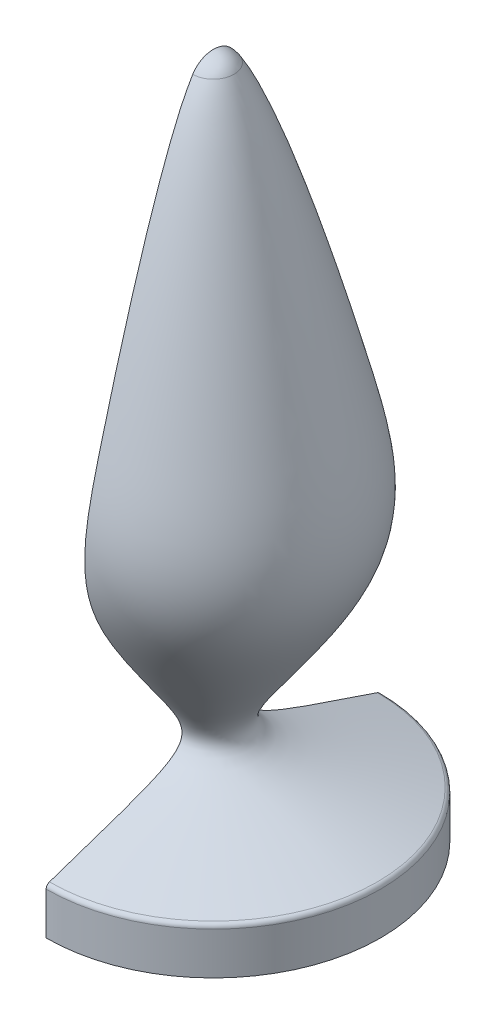
ISO-10303-21;
HEADER;
FILE_DESCRIPTION(('STEP AP214'),'2;1');
FILE_NAME('part.step','',(''),(''),'','','');
FILE_SCHEMA(('AUTOMOTIVE_DESIGN { 1 0 10303 214 1 1 1 1 }'));
ENDSEC;
DATA;
#1=APPLICATION_CONTEXT('core data for automotive mechanical design processes');
#2=APPLICATION_PROTOCOL_DEFINITION('international standard','automotive_design',2000,#1);
#3=PRODUCT_CONTEXT('',#1,'mechanical');
#4=PRODUCT('Part','Part','',(#3));
#5=PRODUCT_RELATED_PRODUCT_CATEGORY('part','',(#4));
#6=PRODUCT_DEFINITION_FORMATION('','',#4);
#7=PRODUCT_DEFINITION_CONTEXT('part definition',#1,'design');
#8=PRODUCT_DEFINITION('design','',#6,#7);
#9=PRODUCT_DEFINITION_SHAPE('','',#8);
#10=(LENGTH_UNIT() NAMED_UNIT(*) SI_UNIT(.MILLI.,.METRE.));
#11=(NAMED_UNIT(*) PLANE_ANGLE_UNIT() SI_UNIT($,.RADIAN.));
#12=(NAMED_UNIT(*) SI_UNIT($,.STERADIAN.) SOLID_ANGLE_UNIT());
#13=UNCERTAINTY_MEASURE_WITH_UNIT(LENGTH_MEASURE(1.E-05),#10,'distance_accuracy_value','');
#14=(GEOMETRIC_REPRESENTATION_CONTEXT(3) GLOBAL_UNCERTAINTY_ASSIGNED_CONTEXT((#13)) GLOBAL_UNIT_ASSIGNED_CONTEXT((#10,
#11,#12)) REPRESENTATION_CONTEXT('',''));
#15=CARTESIAN_POINT('',(0.,0.,0.));
#16=DIRECTION('',(0.,0.,1.));
#17=DIRECTION('',(1.,0.,0.));
#18=AXIS2_PLACEMENT_3D('',#15,#16,#17);
#19=CARTESIAN_POINT('',(17.399,-71.3771720125921,0.));
#20=DIRECTION('',(0.,-1.,0.));
#21=DIRECTION('',(0.,0.,-1.));
#22=AXIS2_PLACEMENT_3D('',#19,#20,#21);
#23=PLANE('',#22);
#24=CARTESIAN_POINT('',(0.,-71.3771720125921,0.));
#25=DIRECTION('',(0.,-1.,0.));
#26=DIRECTION('',(0.,0.,-1.));
#27=AXIS2_PLACEMENT_3D('',#24,#25,#26);
#28=CIRCLE('',#27,17.399);
#29=CARTESIAN_POINT('',(0.,-71.3771720125921,-17.3989999999999));
#30=VERTEX_POINT('',#29);
#31=CARTESIAN_POINT('',(0.,-71.3771720125921,17.399));
#32=VERTEX_POINT('',#31);
#33=EDGE_CURVE('E90',#30,#32,#28,.T.);
#34=ORIENTED_EDGE('',*,*,#33,.T.);
#35=DIRECTION('',(0.,0.,-1.));
#36=VECTOR('',#35,1.);
#37=CARTESIAN_POINT('',(0.,-71.3771720125921,0.));
#38=LINE('',#37,#36);
#39=EDGE_CURVE('E91',#32,#30,#38,.T.);
#40=ORIENTED_EDGE('',*,*,#39,.T.);
#41=EDGE_LOOP('',(#34,#40));
#42=FACE_BOUND('',#41,.T.);
#43=ADVANCED_FACE('F39',(#42),#23,.T.);
#44=CARTESIAN_POINT('',(0.,-71.3771720125921,0.));
#45=DIRECTION('',(0.,-1.,0.));
#46=DIRECTION('',(0.,0.,-1.));
#47=AXIS2_PLACEMENT_3D('',#44,#45,#46);
#48=CYLINDRICAL_SURFACE('',#47,17.3989999999999);
#49=ORIENTED_EDGE('',*,*,#33,.F.);
#50=DIRECTION('',(0.,-1.,0.));
#51=VECTOR('',#50,1.);
#52=CARTESIAN_POINT('',(0.,-71.3771720125921,-17.3989999999999));
#53=LINE('',#52,#51);
#54=CARTESIAN_POINT('',(0.,-66.9785709211312,-17.3989999999999));
#55=VERTEX_POINT('',#54);
#56=EDGE_CURVE('E77',#30,#55,#53,.F.);
#57=ORIENTED_EDGE('',*,*,#56,.T.);
#58=CARTESIAN_POINT('',(0.,-66.9785709211312,0.));
#59=DIRECTION('',(0.,1.,0.));
#60=DIRECTION('',(0.,0.,1.));
#61=AXIS2_PLACEMENT_3D('',#58,#59,#60);
#62=CIRCLE('',#61,17.3989999999999);
#63=CARTESIAN_POINT('',(0.,-66.9785709211312,17.3989999999999));
#64=VERTEX_POINT('',#63);
#65=EDGE_CURVE('E88',#55,#64,#62,.F.);
#66=ORIENTED_EDGE('',*,*,#65,.T.);
#67=DIRECTION('',(0.,-1.,0.));
#68=VECTOR('',#67,1.);
#69=CARTESIAN_POINT('',(0.,-71.3771720125921,17.3989999999999));
#70=LINE('',#69,#68);
#71=EDGE_CURVE('E61',#64,#32,#70,.T.);
#72=ORIENTED_EDGE('',*,*,#71,.T.);
#73=EDGE_LOOP('',(#49,#57,#66,#72));
#74=FACE_BOUND('',#73,.T.);
#75=ADVANCED_FACE('F87',(#74),#48,.T.);
#76=CARTESIAN_POINT('',(17.3989999999997,-66.614672012592,0.));
#77=CARTESIAN_POINT('',(0.738552126119461,-60.9479264676867,0.));
#78=CARTESIAN_POINT('',(1.14621740284453,-61.924501885455,0.));
#79=CARTESIAN_POINT('',(12.2716685103279,-46.216037014803,0.));
#80=CARTESIAN_POINT('',(14.5262599507277,-40.9815264299858,0.));
#81=CARTESIAN_POINT('',(8.98003697359334,-18.8821179330674,0.));
#82=CARTESIAN_POINT('',(4.70283696743008,-5.21078677583494,0.));
#83=CARTESIAN_POINT('',(2.14469056079191,-1.1791537932411,0.));
#84=B_SPLINE_CURVE_WITH_KNOTS('',3,(#76,#77,#78,#79,#80,#81,#82,#83),.UNSPECIFIED.,.F.,.F.,(4,1,
1,1,1,4),(0.105965392109123,0.387599050081787,0.420534076841615,0.597790145714446,
0.657952438891195,1.),.UNSPECIFIED.);
#85=CARTESIAN_POINT('',(0.,-71.3771720125921,0.));
#86=DIRECTION('',(0.,-1.,0.));
#87=AXIS1_PLACEMENT('',#85,#86);
#88=SURFACE_OF_REVOLUTION('',#84,#87);
#89=CARTESIAN_POINT('',(0.,-66.4975416115697,0.));
#90=DIRECTION('',(0.,-1.,0.));
#91=DIRECTION('',(0.,0.,-1.));
#92=AXIS2_PLACEMENT_3D('',#89,#90,#91);
#93=CIRCLE('',#92,17.054324227666);
#94=CARTESIAN_POINT('',(0.,-66.4975416115699,17.0543242276667));
#95=VERTEX_POINT('',#94);
#96=CARTESIAN_POINT('',(0.,-66.4975416115697,-17.054324227666));
#97=VERTEX_POINT('',#96);
#98=EDGE_CURVE('E83',#95,#97,#93,.F.);
#99=ORIENTED_EDGE('',*,*,#98,.T.);
#100=CARTESIAN_POINT('',(0.,-66.614672012592,-17.3989999999997));
#101=CARTESIAN_POINT('',(0.,-60.9479264676867,-0.738552126119461));
#102=CARTESIAN_POINT('',(0.,-61.924501885455,-1.14621740284453));
#103=CARTESIAN_POINT('',(0.,-46.216037014803,-12.2716685103279));
#104=CARTESIAN_POINT('',(0.,-40.9815264299858,-14.5262599507277));
#105=CARTESIAN_POINT('',(0.,-18.8821179330674,-8.98003697359334));
#106=CARTESIAN_POINT('',(0.,-5.21078677583494,-4.70283696743008));
#107=CARTESIAN_POINT('',(0.,-1.1791537932411,-2.14469056079191));
#108=B_SPLINE_CURVE_WITH_KNOTS('',3,(#100,#101,#102,#103,#104,#105,#106,#107),.UNSPECIFIED.,.F.,
.F.,(4,1,1,1,1,4),(0.105965392109123,0.387599050081787,0.420534076841615,0.597790145714446,
0.657952438891195,1.),.UNSPECIFIED.);
#109=CARTESIAN_POINT('',(0.,-1.1791537932411,-2.14469056079191));
#110=VERTEX_POINT('',#109);
#111=EDGE_CURVE('E54',#97,#110,#108,.T.);
#112=ORIENTED_EDGE('',*,*,#111,.T.);
#113=CARTESIAN_POINT('',(0.,-1.1791537932411,0.));
#114=DIRECTION('',(0.,-1.,0.));
#115=DIRECTION('',(0.,0.,-1.));
#116=AXIS2_PLACEMENT_3D('',#113,#114,#115);
#117=CIRCLE('',#116,2.14469056079191);
#118=CARTESIAN_POINT('',(0.,-1.1791537932411,2.14469056079191));
#119=VERTEX_POINT('',#118);
#120=EDGE_CURVE('E95',#110,#119,#117,.T.);
#121=ORIENTED_EDGE('',*,*,#120,.T.);
#122=CARTESIAN_POINT('',(0.,-66.614672012592,17.3989999999997));
#123=CARTESIAN_POINT('',(0.,-60.9479264676867,0.738552126119461));
#124=CARTESIAN_POINT('',(0.,-61.924501885455,1.14621740284453));
#125=CARTESIAN_POINT('',(0.,-46.216037014803,12.2716685103279));
#126=CARTESIAN_POINT('',(0.,-40.9815264299858,14.5262599507277));
#127=CARTESIAN_POINT('',(0.,-18.8821179330674,8.98003697359334));
#128=CARTESIAN_POINT('',(0.,-5.21078677583494,4.70283696743008));
#129=CARTESIAN_POINT('',(0.,-1.1791537932411,2.14469056079191));
#130=B_SPLINE_CURVE_WITH_KNOTS('',3,(#122,#123,#124,#125,#126,#127,#128,#129),.UNSPECIFIED.,.F.,
.F.,(4,1,1,1,1,4),(0.105965392109123,0.387599050081787,0.420534076841615,0.597790145714446,
0.657952438891195,1.),.UNSPECIFIED.);
#131=EDGE_CURVE('E124',#119,#95,#130,.F.);
#132=ORIENTED_EDGE('',*,*,#131,.T.);
#133=EDGE_LOOP('',(#99,#112,#121,#132));
#134=FACE_BOUND('',#133,.T.);
#135=ADVANCED_FACE('F109',(#134),#88,.F.);
#136=CARTESIAN_POINT('',(0.,-2.54,0.));
#137=DIRECTION('',(0.,-1.,0.));
#138=DIRECTION('',(1.,0.,0.));
#139=AXIS2_PLACEMENT_3D('',#136,#137,#138);
#140=SPHERICAL_SURFACE('',#139,2.54);
#141=ORIENTED_EDGE('',*,*,#120,.F.);
#142=CARTESIAN_POINT('',(0.,-2.54,0.));
#143=DIRECTION('',(-1.,0.,0.));
#144=DIRECTION('',(0.,-1.,0.));
#145=AXIS2_PLACEMENT_3D('',#142,#143,#144);
#146=CIRCLE('',#145,2.54);
#147=EDGE_CURVE('E121',#110,#119,#146,.F.);
#148=ORIENTED_EDGE('',*,*,#147,.T.);
#149=EDGE_LOOP('',(#141,#148));
#150=FACE_BOUND('',#149,.T.);
#151=ADVANCED_FACE('F113',(#150),#140,.T.);
#152=CARTESIAN_POINT('',(0.,-66.9785709211312,0.));
#153=DIRECTION('',(0.,1.,0.));
#154=DIRECTION('',(0.,0.,1.));
#155=AXIS2_PLACEMENT_3D('',#152,#153,#154);
#156=TOROIDAL_SURFACE('',#155,16.8909999999999,0.508);
#157=ORIENTED_EDGE('',*,*,#98,.F.);
#158=CARTESIAN_POINT('',(0.,-66.9785709211312,16.8909999999999));
#159=DIRECTION('',(-1.,0.,0.));
#160=DIRECTION('',(0.,-1.,0.));
#161=AXIS2_PLACEMENT_3D('',#158,#159,#160);
#162=CIRCLE('',#161,0.508);
#163=EDGE_CURVE('E11',#95,#64,#162,.F.);
#164=ORIENTED_EDGE('',*,*,#163,.T.);
#165=ORIENTED_EDGE('',*,*,#65,.F.);
#166=CARTESIAN_POINT('',(0.,-66.9785709211312,-16.8909999999999));
#167=DIRECTION('',(-1.,0.,0.));
#168=DIRECTION('',(0.,-1.,0.));
#169=AXIS2_PLACEMENT_3D('',#166,#167,#168);
#170=CIRCLE('',#169,0.508);
#171=EDGE_CURVE('E47',#55,#97,#170,.F.);
#172=ORIENTED_EDGE('',*,*,#171,.T.);
#173=EDGE_LOOP('',(#157,#164,#165,#172));
#174=FACE_BOUND('',#173,.T.);
#175=ADVANCED_FACE('F41',(#174),#156,.T.);
#176=CARTESIAN_POINT('',(0.,97.851998641352,25.4));
#177=DIRECTION('',(-1.,0.,0.));
#178=DIRECTION('',(0.,-1.,0.));
#179=AXIS2_PLACEMENT_3D('',#176,#177,#178);
#180=PLANE('',#179);
#181=ORIENTED_EDGE('',*,*,#131,.F.);
#182=ORIENTED_EDGE('',*,*,#147,.F.);
#183=ORIENTED_EDGE('',*,*,#111,.F.);
#184=ORIENTED_EDGE('',*,*,#171,.F.);
#185=ORIENTED_EDGE('',*,*,#56,.F.);
#186=ORIENTED_EDGE('',*,*,#39,.F.);
#187=ORIENTED_EDGE('',*,*,#71,.F.);
#188=ORIENTED_EDGE('',*,*,#163,.F.);
#189=EDGE_LOOP('',(#181,#182,#183,#184,#185,#186,#187,#188));
#190=FACE_BOUND('',#189,.T.);
#191=ADVANCED_FACE('F76',(#190),#180,.T.);
#192=CLOSED_SHELL('',(#43,#75,#135,#151,#175,#191));
#193=MANIFOLD_SOLID_BREP('B2',#192);
#194=ADVANCED_BREP_SHAPE_REPRESENTATION('',(#18,#193),#14);
#195=SHAPE_DEFINITION_REPRESENTATION(#9,#194);
ENDSEC;
END-ISO-10303-21;
